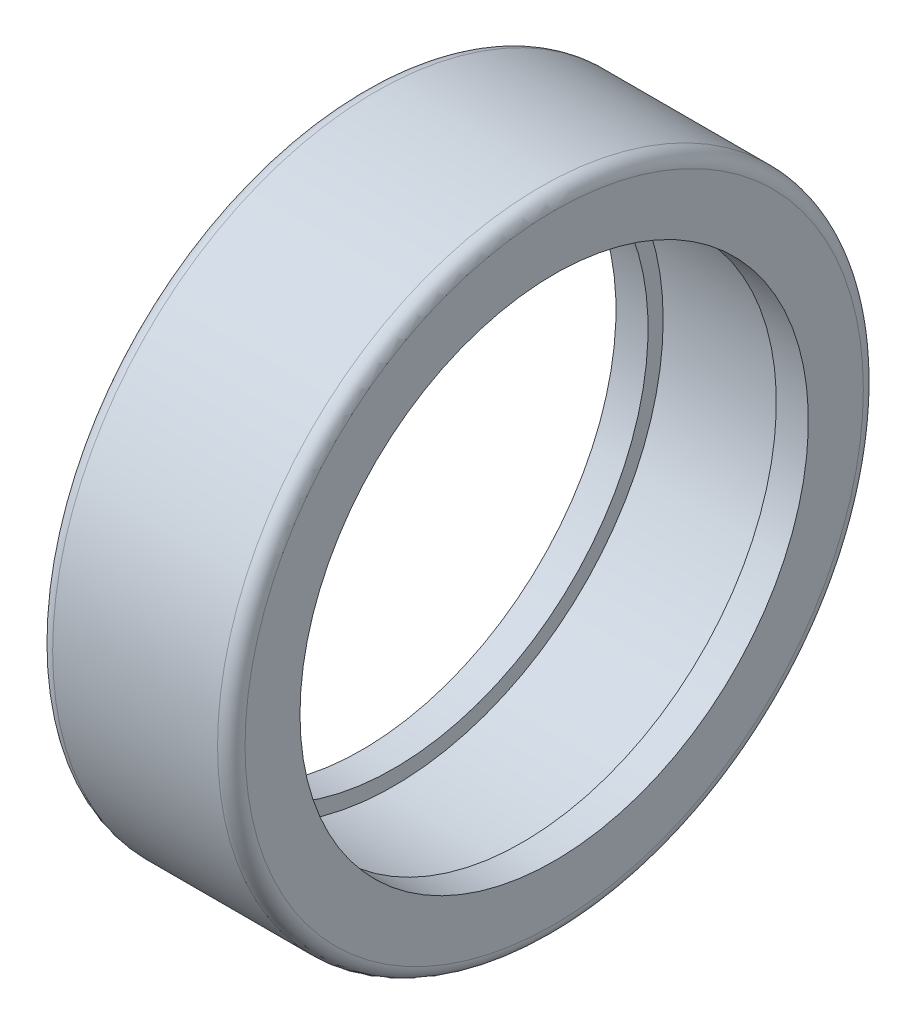
ISO-10303-21;
HEADER;
FILE_DESCRIPTION(('STEP AP214'),'2;1');
FILE_NAME('part.step','',(''),(''),'','','');
FILE_SCHEMA(('AUTOMOTIVE_DESIGN { 1 0 10303 214 1 1 1 1 }'));
ENDSEC;
DATA;
#1=APPLICATION_CONTEXT('core data for automotive mechanical design processes');
#2=APPLICATION_PROTOCOL_DEFINITION('international standard','automotive_design',2000,#1);
#3=PRODUCT_CONTEXT('',#1,'mechanical');
#4=PRODUCT('Part','Part','',(#3));
#5=PRODUCT_RELATED_PRODUCT_CATEGORY('part','',(#4));
#6=PRODUCT_DEFINITION_FORMATION('','',#4);
#7=PRODUCT_DEFINITION_CONTEXT('part definition',#1,'design');
#8=PRODUCT_DEFINITION('design','',#6,#7);
#9=PRODUCT_DEFINITION_SHAPE('','',#8);
#10=(LENGTH_UNIT() NAMED_UNIT(*) SI_UNIT(.MILLI.,.METRE.));
#11=(NAMED_UNIT(*) PLANE_ANGLE_UNIT() SI_UNIT($,.RADIAN.));
#12=(NAMED_UNIT(*) SI_UNIT($,.STERADIAN.) SOLID_ANGLE_UNIT());
#13=UNCERTAINTY_MEASURE_WITH_UNIT(LENGTH_MEASURE(1.E-05),#10,'distance_accuracy_value','');
#14=(GEOMETRIC_REPRESENTATION_CONTEXT(3) GLOBAL_UNCERTAINTY_ASSIGNED_CONTEXT((#13)) GLOBAL_UNIT_ASSIGNED_CONTEXT((#10,
#11,#12)) REPRESENTATION_CONTEXT('',''));
#15=CARTESIAN_POINT('',(0.,0.,0.));
#16=DIRECTION('',(0.,0.,1.));
#17=DIRECTION('',(1.,0.,0.));
#18=AXIS2_PLACEMENT_3D('',#15,#16,#17);
#19=CARTESIAN_POINT('',(2.33333333333333,18.5,0.));
#20=DIRECTION('',(-1.,0.,0.));
#21=DIRECTION('',(0.,0.,1.));
#22=AXIS2_PLACEMENT_3D('',#19,#20,#21);
#23=PLANE('',#22);
#24=CARTESIAN_POINT('',(2.33333333333333,0.,0.));
#25=DIRECTION('',(-1.,0.,0.));
#26=DIRECTION('',(0.,0.,1.));
#27=AXIS2_PLACEMENT_3D('',#24,#25,#26);
#28=CIRCLE('',#27,19.6);
#29=CARTESIAN_POINT('',(2.33333333333333,0.,19.6));
#30=VERTEX_POINT('',#29);
#31=EDGE_CURVE('E10',#30,#30,#28,.T.);
#32=ORIENTED_EDGE('',*,*,#31,.F.);
#33=EDGE_LOOP('',(#32));
#34=FACE_BOUND('',#33,.T.);
#35=CARTESIAN_POINT('',(2.33333333333333,0.,0.));
#36=DIRECTION('',(-1.,0.,0.));
#37=DIRECTION('',(0.,0.,1.));
#38=AXIS2_PLACEMENT_3D('',#35,#36,#37);
#39=CIRCLE('',#38,18.5);
#40=CARTESIAN_POINT('',(2.33333333333333,0.,18.5));
#41=VERTEX_POINT('',#40);
#42=EDGE_CURVE('E49',#41,#41,#39,.T.);
#43=ORIENTED_EDGE('',*,*,#42,.T.);
#44=EDGE_LOOP('',(#43));
#45=FACE_BOUND('',#44,.T.);
#46=ADVANCED_FACE('F15',(#34,#45),#23,.F.);
#47=CARTESIAN_POINT('',(0.,0.,0.));
#48=DIRECTION('',(-1.,0.,0.));
#49=DIRECTION('',(0.,0.,1.));
#50=AXIS2_PLACEMENT_3D('',#47,#48,#49);
#51=CYLINDRICAL_SURFACE('',#50,19.6);
#52=CARTESIAN_POINT('',(11.6666666666667,0.,0.));
#53=DIRECTION('',(-1.,0.,0.));
#54=DIRECTION('',(0.,0.,1.));
#55=AXIS2_PLACEMENT_3D('',#52,#53,#54);
#56=CIRCLE('',#55,19.6);
#57=CARTESIAN_POINT('',(11.6666666666667,0.,19.6));
#58=VERTEX_POINT('',#57);
#59=EDGE_CURVE('E21',#58,#58,#56,.T.);
#60=ORIENTED_EDGE('',*,*,#59,.F.);
#61=EDGE_LOOP('',(#60));
#62=FACE_BOUND('',#61,.T.);
#63=ORIENTED_EDGE('',*,*,#31,.T.);
#64=EDGE_LOOP('',(#63));
#65=FACE_BOUND('',#64,.T.);
#66=ADVANCED_FACE('F98',(#62,#65),#51,.F.);
#67=CARTESIAN_POINT('',(11.6666666666667,19.6,0.));
#68=DIRECTION('',(1.,0.,0.));
#69=DIRECTION('',(0.,0.,-1.));
#70=AXIS2_PLACEMENT_3D('',#67,#68,#69);
#71=PLANE('',#70);
#72=CARTESIAN_POINT('',(11.6666666666667,0.,0.));
#73=DIRECTION('',(-1.,0.,0.));
#74=DIRECTION('',(0.,0.,1.));
#75=AXIS2_PLACEMENT_3D('',#72,#73,#74);
#76=CIRCLE('',#75,18.5);
#77=CARTESIAN_POINT('',(11.6666666666667,0.,18.5));
#78=VERTEX_POINT('',#77);
#79=EDGE_CURVE('E25',#78,#78,#76,.T.);
#80=ORIENTED_EDGE('',*,*,#79,.F.);
#81=EDGE_LOOP('',(#80));
#82=FACE_BOUND('',#81,.T.);
#83=ORIENTED_EDGE('',*,*,#59,.T.);
#84=EDGE_LOOP('',(#83));
#85=FACE_BOUND('',#84,.T.);
#86=ADVANCED_FACE('F93',(#82,#85),#71,.F.);
#87=CARTESIAN_POINT('',(0.,0.,0.));
#88=DIRECTION('',(-1.,0.,0.));
#89=DIRECTION('',(0.,0.,1.));
#90=AXIS2_PLACEMENT_3D('',#87,#88,#89);
#91=CYLINDRICAL_SURFACE('',#90,18.5);
#92=CARTESIAN_POINT('',(14.,0.,0.));
#93=DIRECTION('',(-1.,0.,0.));
#94=DIRECTION('',(0.,0.,1.));
#95=AXIS2_PLACEMENT_3D('',#92,#93,#94);
#96=CIRCLE('',#95,18.5);
#97=CARTESIAN_POINT('',(14.,0.,18.5));
#98=VERTEX_POINT('',#97);
#99=EDGE_CURVE('E29',#98,#98,#96,.T.);
#100=ORIENTED_EDGE('',*,*,#99,.F.);
#101=EDGE_LOOP('',(#100));
#102=FACE_BOUND('',#101,.T.);
#103=ORIENTED_EDGE('',*,*,#79,.T.);
#104=EDGE_LOOP('',(#103));
#105=FACE_BOUND('',#104,.T.);
#106=ADVANCED_FACE('F87',(#102,#105),#91,.F.);
#107=CARTESIAN_POINT('',(14.,18.5,0.));
#108=DIRECTION('',(-1.,0.,0.));
#109=DIRECTION('',(0.,0.,1.));
#110=AXIS2_PLACEMENT_3D('',#107,#108,#109);
#111=PLANE('',#110);
#112=CARTESIAN_POINT('',(14.,0.,0.));
#113=DIRECTION('',(-1.,0.,0.));
#114=DIRECTION('',(0.,0.,1.));
#115=AXIS2_PLACEMENT_3D('',#112,#113,#114);
#116=CIRCLE('',#115,22.5);
#117=CARTESIAN_POINT('',(14.,0.,22.5));
#118=VERTEX_POINT('',#117);
#119=EDGE_CURVE('E34',#118,#118,#116,.T.);
#120=ORIENTED_EDGE('',*,*,#119,.F.);
#121=EDGE_LOOP('',(#120));
#122=FACE_BOUND('',#121,.T.);
#123=ORIENTED_EDGE('',*,*,#99,.T.);
#124=EDGE_LOOP('',(#123));
#125=FACE_BOUND('',#124,.T.);
#126=ADVANCED_FACE('F81',(#122,#125),#111,.F.);
#127=CARTESIAN_POINT('',(13.,0.,0.));
#128=DIRECTION('',(-1.,0.,0.));
#129=DIRECTION('',(0.,0.,1.));
#130=AXIS2_PLACEMENT_3D('',#127,#128,#129);
#131=TOROIDAL_SURFACE('',#130,22.5,1.);
#132=CARTESIAN_POINT('',(13.,0.,0.));
#133=DIRECTION('',(-1.,0.,0.));
#134=DIRECTION('',(0.,0.,1.));
#135=AXIS2_PLACEMENT_3D('',#132,#133,#134);
#136=CIRCLE('',#135,23.5);
#137=CARTESIAN_POINT('',(13.,0.,23.5));
#138=VERTEX_POINT('',#137);
#139=EDGE_CURVE('E37',#138,#138,#136,.T.);
#140=ORIENTED_EDGE('',*,*,#139,.F.);
#141=EDGE_LOOP('',(#140));
#142=FACE_BOUND('',#141,.T.);
#143=ORIENTED_EDGE('',*,*,#119,.T.);
#144=EDGE_LOOP('',(#143));
#145=FACE_BOUND('',#144,.T.);
#146=ADVANCED_FACE('F75',(#142,#145),#131,.T.);
#147=CARTESIAN_POINT('',(0.,0.,0.));
#148=DIRECTION('',(-1.,0.,0.));
#149=DIRECTION('',(0.,0.,1.));
#150=AXIS2_PLACEMENT_3D('',#147,#148,#149);
#151=CYLINDRICAL_SURFACE('',#150,23.5);
#152=CARTESIAN_POINT('',(1.,0.,0.));
#153=DIRECTION('',(-1.,0.,0.));
#154=DIRECTION('',(0.,0.,1.));
#155=AXIS2_PLACEMENT_3D('',#152,#153,#154);
#156=CIRCLE('',#155,23.5);
#157=CARTESIAN_POINT('',(1.,0.,23.5));
#158=VERTEX_POINT('',#157);
#159=EDGE_CURVE('E40',#158,#158,#156,.T.);
#160=ORIENTED_EDGE('',*,*,#159,.F.);
#161=EDGE_LOOP('',(#160));
#162=FACE_BOUND('',#161,.T.);
#163=ORIENTED_EDGE('',*,*,#139,.T.);
#164=EDGE_LOOP('',(#163));
#165=FACE_BOUND('',#164,.T.);
#166=ADVANCED_FACE('F69',(#162,#165),#151,.T.);
#167=CARTESIAN_POINT('',(1.,0.,0.));
#168=DIRECTION('',(-1.,0.,0.));
#169=DIRECTION('',(0.,0.,1.));
#170=AXIS2_PLACEMENT_3D('',#167,#168,#169);
#171=TOROIDAL_SURFACE('',#170,22.5,1.);
#172=CARTESIAN_POINT('',(0.,0.,0.));
#173=DIRECTION('',(-1.,0.,0.));
#174=DIRECTION('',(0.,0.,1.));
#175=AXIS2_PLACEMENT_3D('',#172,#173,#174);
#176=CIRCLE('',#175,22.5);
#177=CARTESIAN_POINT('',(0.,0.,22.5));
#178=VERTEX_POINT('',#177);
#179=EDGE_CURVE('E43',#178,#178,#176,.T.);
#180=ORIENTED_EDGE('',*,*,#179,.F.);
#181=EDGE_LOOP('',(#180));
#182=FACE_BOUND('',#181,.T.);
#183=ORIENTED_EDGE('',*,*,#159,.T.);
#184=EDGE_LOOP('',(#183));
#185=FACE_BOUND('',#184,.T.);
#186=ADVANCED_FACE('F63',(#182,#185),#171,.T.);
#187=CARTESIAN_POINT('',(0.,22.5,0.));
#188=DIRECTION('',(1.,0.,0.));
#189=DIRECTION('',(0.,0.,-1.));
#190=AXIS2_PLACEMENT_3D('',#187,#188,#189);
#191=PLANE('',#190);
#192=CARTESIAN_POINT('',(0.,0.,0.));
#193=DIRECTION('',(-1.,0.,0.));
#194=DIRECTION('',(0.,0.,1.));
#195=AXIS2_PLACEMENT_3D('',#192,#193,#194);
#196=CIRCLE('',#195,18.5);
#197=CARTESIAN_POINT('',(0.,0.,18.5));
#198=VERTEX_POINT('',#197);
#199=EDGE_CURVE('E46',#198,#198,#196,.T.);
#200=ORIENTED_EDGE('',*,*,#199,.F.);
#201=EDGE_LOOP('',(#200));
#202=FACE_BOUND('',#201,.T.);
#203=ORIENTED_EDGE('',*,*,#179,.T.);
#204=EDGE_LOOP('',(#203));
#205=FACE_BOUND('',#204,.T.);
#206=ADVANCED_FACE('F57',(#202,#205),#191,.F.);
#207=CARTESIAN_POINT('',(0.,0.,0.));
#208=DIRECTION('',(-1.,0.,0.));
#209=DIRECTION('',(0.,0.,1.));
#210=AXIS2_PLACEMENT_3D('',#207,#208,#209);
#211=CYLINDRICAL_SURFACE('',#210,18.5);
#212=ORIENTED_EDGE('',*,*,#42,.F.);
#213=EDGE_LOOP('',(#212));
#214=FACE_BOUND('',#213,.T.);
#215=ORIENTED_EDGE('',*,*,#199,.T.);
#216=EDGE_LOOP('',(#215));
#217=FACE_BOUND('',#216,.T.);
#218=ADVANCED_FACE('F54',(#214,#217),#211,.F.);
#219=CLOSED_SHELL('',(#46,#66,#86,#106,#126,#146,#166,#186,#206,#218));
#220=MANIFOLD_SOLID_BREP('B1',#219);
#221=ADVANCED_BREP_SHAPE_REPRESENTATION('',(#18,#220),#14);
#222=SHAPE_DEFINITION_REPRESENTATION(#9,#221);
ENDSEC;
END-ISO-10303-21;
